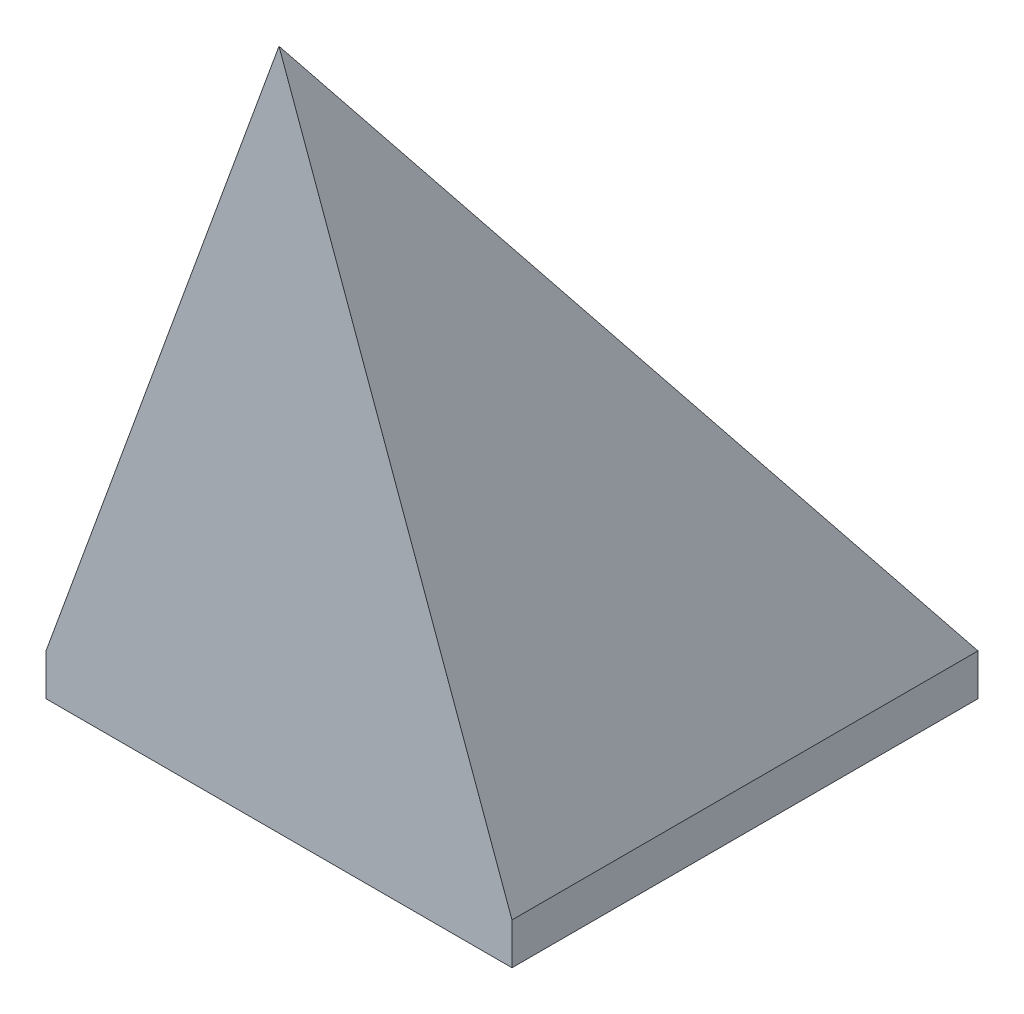
ISO-10303-21;
HEADER;
FILE_DESCRIPTION(('STEP AP214'),'2;1');
FILE_NAME('part.step','',(''),(''),'','','');
FILE_SCHEMA(('AUTOMOTIVE_DESIGN { 1 0 10303 214 1 1 1 1 }'));
ENDSEC;
DATA;
#1=APPLICATION_CONTEXT('core data for automotive mechanical design processes');
#2=APPLICATION_PROTOCOL_DEFINITION('international standard','automotive_design',2000,#1);
#3=PRODUCT_CONTEXT('',#1,'mechanical');
#4=PRODUCT('Part','Part','',(#3));
#5=PRODUCT_RELATED_PRODUCT_CATEGORY('part','',(#4));
#6=PRODUCT_DEFINITION_FORMATION('','',#4);
#7=PRODUCT_DEFINITION_CONTEXT('part definition',#1,'design');
#8=PRODUCT_DEFINITION('design','',#6,#7);
#9=PRODUCT_DEFINITION_SHAPE('','',#8);
#10=(LENGTH_UNIT() NAMED_UNIT(*) SI_UNIT(.MILLI.,.METRE.));
#11=(NAMED_UNIT(*) PLANE_ANGLE_UNIT() SI_UNIT($,.RADIAN.));
#12=(NAMED_UNIT(*) SI_UNIT($,.STERADIAN.) SOLID_ANGLE_UNIT());
#13=UNCERTAINTY_MEASURE_WITH_UNIT(LENGTH_MEASURE(1.E-05),#10,'distance_accuracy_value','');
#14=(GEOMETRIC_REPRESENTATION_CONTEXT(3) GLOBAL_UNCERTAINTY_ASSIGNED_CONTEXT((#13)) GLOBAL_UNIT_ASSIGNED_CONTEXT((#10,
#11,#12)) REPRESENTATION_CONTEXT('',''));
#15=CARTESIAN_POINT('',(0.,0.,0.));
#16=DIRECTION('',(0.,0.,1.));
#17=DIRECTION('',(1.,0.,0.));
#18=AXIS2_PLACEMENT_3D('',#15,#16,#17);
#19=CARTESIAN_POINT('',(0.,0.,-5.));
#20=DIRECTION('',(0.,0.,-1.));
#21=DIRECTION('',(-1.,0.,0.));
#22=AXIS2_PLACEMENT_3D('',#19,#20,#21);
#23=PLANE('',#22);
#24=DIRECTION('',(0.,1.,0.));
#25=VECTOR('',#24,1.);
#26=CARTESIAN_POINT('',(25.,3.99999999999999,-5.));
#27=LINE('',#26,#25);
#28=CARTESIAN_POINT('',(25.,8.99999999999999,-5.));
#29=VERTEX_POINT('',#28);
#30=CARTESIAN_POINT('',(25.,26.6917459263319,-5.));
#31=VERTEX_POINT('',#30);
#32=EDGE_CURVE('E216',#29,#31,#27,.T.);
#33=ORIENTED_EDGE('',*,*,#32,.T.);
#34=DIRECTION('',(1.,0.,0.));
#35=VECTOR('',#34,1.);
#36=CARTESIAN_POINT('',(-9.2416804367933,26.6917459263319,-5.));
#37=LINE('',#36,#35);
#38=CARTESIAN_POINT('',(29.7408799192839,26.6917459263319,-5.));
#39=VERTEX_POINT('',#38);
#40=EDGE_CURVE('E202',#31,#39,#37,.T.);
#41=ORIENTED_EDGE('',*,*,#40,.T.);
#42=DIRECTION('',(0.342020143325666,-0.939692620785909,0.));
#43=VECTOR('',#42,1.);
#44=CARTESIAN_POINT('',(15.5,65.8182419377296,-5.));
#45=LINE('',#44,#43);
#46=CARTESIAN_POINT('',(36.180148828669,9.,-5.));
#47=VERTEX_POINT('',#46);
#48=EDGE_CURVE('E291',#39,#47,#45,.T.);
#49=ORIENTED_EDGE('',*,*,#48,.T.);
#50=DIRECTION('',(-1.,0.,0.));
#51=VECTOR('',#50,1.);
#52=CARTESIAN_POINT('',(0.,8.99999999999999,-5.));
#53=LINE('',#52,#51);
#54=EDGE_CURVE('E399',#47,#29,#53,.T.);
#55=ORIENTED_EDGE('',*,*,#54,.T.);
#56=EDGE_LOOP('',(#33,#41,#49,#55));
#57=FACE_BOUND('',#56,.T.);
#58=ADVANCED_FACE('F47',(#57),#23,.T.);
#59=CARTESIAN_POINT('',(0.,4.,0.));
#60=DIRECTION('',(0.,-1.,0.));
#61=DIRECTION('',(0.,0.,-1.));
#62=AXIS2_PLACEMENT_3D('',#59,#60,#61);
#63=PLANE('',#62);
#64=CARTESIAN_POINT('',(30.,4.,-30.));
#65=DIRECTION('',(0.,1.,0.));
#66=DIRECTION('',(0.,0.,1.));
#67=AXIS2_PLACEMENT_3D('',#64,#65,#66);
#68=CIRCLE('',#67,1.7);
#69=CARTESIAN_POINT('',(30.,4.,-28.3));
#70=VERTEX_POINT('',#69);
#71=EDGE_CURVE('E323',#70,#70,#68,.T.);
#72=ORIENTED_EDGE('',*,*,#71,.F.);
#73=EDGE_LOOP('',(#72));
#74=FACE_BOUND('',#73,.T.);
#75=CARTESIAN_POINT('',(30.,4.,-15.));
#76=DIRECTION('',(0.,1.,0.));
#77=DIRECTION('',(0.,0.,1.));
#78=AXIS2_PLACEMENT_3D('',#75,#76,#77);
#79=CIRCLE('',#78,1.7);
#80=CARTESIAN_POINT('',(30.,4.,-13.3));
#81=VERTEX_POINT('',#80);
#82=EDGE_CURVE('E307',#81,#81,#79,.T.);
#83=ORIENTED_EDGE('',*,*,#82,.F.);
#84=EDGE_LOOP('',(#83));
#85=FACE_BOUND('',#84,.T.);
#86=DIRECTION('',(1.,0.,0.));
#87=VECTOR('',#86,1.);
#88=CARTESIAN_POINT('',(-1.04926296840795,4.00000000000002,-40.0123714323412));
#89=LINE('',#88,#87);
#90=CARTESIAN_POINT('',(25.,4.00000000000002,-40.0123714323412));
#91=VERTEX_POINT('',#90);
#92=CARTESIAN_POINT('',(40.6259278574256,4.,-40.0123714323412));
#93=VERTEX_POINT('',#92);
#94=EDGE_CURVE('E248',#91,#93,#89,.T.);
#95=ORIENTED_EDGE('',*,*,#94,.F.);
#96=DIRECTION('',(0.,0.,-1.));
#97=VECTOR('',#96,1.);
#98=CARTESIAN_POINT('',(25.,3.99999999999999,15.7251116191808));
#99=LINE('',#98,#97);
#100=CARTESIAN_POINT('',(25.,4.,-10.));
#101=VERTEX_POINT('',#100);
#102=EDGE_CURVE('E213',#101,#91,#99,.T.);
#103=ORIENTED_EDGE('',*,*,#102,.F.);
#104=DIRECTION('',(1.,0.,0.));
#105=VECTOR('',#104,1.);
#106=CARTESIAN_POINT('',(0.,4.,-10.));
#107=LINE('',#106,#105);
#108=CARTESIAN_POINT('',(38.375,4.,-10.));
#109=VERTEX_POINT('',#108);
#110=EDGE_CURVE('E389',#101,#109,#107,.T.);
#111=ORIENTED_EDGE('',*,*,#110,.T.);
#112=DIRECTION('',(-0.0747899482416341,0.,0.997199309888456));
#113=VECTOR('',#112,1.);
#114=CARTESIAN_POINT('',(41.,4.,-45.));
#115=LINE('',#114,#113);
#116=EDGE_CURVE('E287',#93,#109,#115,.T.);
#117=ORIENTED_EDGE('',*,*,#116,.F.);
#118=EDGE_LOOP('',(#95,#103,#111,#117));
#119=FACE_BOUND('',#118,.T.);
#120=ADVANCED_FACE('F447',(#74,#85,#119),#63,.F.);
#121=CARTESIAN_POINT('',(-1.63682684084202,6.29745498866973,-43.3275895391157));
#122=DIRECTION('',(0.,-0.821924771568956,-0.569596058519825));
#123=DIRECTION('',(0.,0.569596058519825,-0.821924771568956));
#124=AXIS2_PLACEMENT_3D('',#121,#122,#123);
#125=PLANE('',#124);
#126=DIRECTION('',(1.,0.,0.));
#127=VECTOR('',#126,1.);
#128=CARTESIAN_POINT('',(-1.63682684084202,6.29745498866973,-43.3275895391157));
#129=LINE('',#128,#127);
#130=CARTESIAN_POINT('',(25.,6.29745498866973,-43.3275895391157));
#131=VERTEX_POINT('',#130);
#132=CARTESIAN_POINT('',(40.0383639849915,6.29745498866972,-43.3275895391157));
#133=VERTEX_POINT('',#132);
#134=EDGE_CURVE('E64',#131,#133,#129,.T.);
#135=ORIENTED_EDGE('',*,*,#134,.F.);
#136=DIRECTION('',(0.,-0.569596058519825,0.821924771568956));
#137=VECTOR('',#136,1.);
#138=CARTESIAN_POINT('',(25.,6.29745498866972,-43.3275895391157));
#139=LINE('',#138,#137);
#140=EDGE_CURVE('E207',#131,#91,#139,.T.);
#141=ORIENTED_EDGE('',*,*,#140,.T.);
#142=ORIENTED_EDGE('',*,*,#94,.T.);
#143=DIRECTION('',(-0.144150231282634,0.563647091857813,-0.813340437124205));
#144=VECTOR('',#143,1.);
#145=CARTESIAN_POINT('',(40.0383639849915,6.29745498866972,-43.3275895391157));
#146=LINE('',#145,#144);
#147=EDGE_CURVE('E262',#93,#133,#146,.T.);
#148=ORIENTED_EDGE('',*,*,#147,.T.);
#149=EDGE_LOOP('',(#135,#141,#142,#148));
#150=FACE_BOUND('',#149,.T.);
#151=ADVANCED_FACE('F444',(#150),#125,.F.);
#152=CARTESIAN_POINT('',(0.,4.,-10.));
#153=DIRECTION('',(0.,-0.707106781186551,0.707106781186543));
#154=DIRECTION('',(1.,0.,0.));
#155=AXIS2_PLACEMENT_3D('',#152,#153,#154);
#156=PLANE('',#155);
#157=ORIENTED_EDGE('',*,*,#110,.F.);
#158=DIRECTION('',(0.,0.707106781186544,0.707106781186552));
#159=VECTOR('',#158,1.);
#160=CARTESIAN_POINT('',(25.,4.,-10.0000000000001));
#161=LINE('',#160,#159);
#162=EDGE_CURVE('E230',#101,#29,#161,.T.);
#163=ORIENTED_EDGE('',*,*,#162,.T.);
#164=ORIENTED_EDGE('',*,*,#54,.F.);
#165=DIRECTION('',(-0.296446257969895,0.675322003245724,0.675322003245732));
#166=VECTOR('',#165,1.);
#167=CARTESIAN_POINT('',(35.0025902692054,11.6825476251984,-2.31745237480159));
#168=LINE('',#167,#166);
#169=EDGE_CURVE('E394',#109,#47,#168,.T.);
#170=ORIENTED_EDGE('',*,*,#169,.F.);
#171=EDGE_LOOP('',(#157,#163,#164,#170));
#172=FACE_BOUND('',#171,.T.);
#173=ADVANCED_FACE('F430',(#172),#156,.F.);
#174=CARTESIAN_POINT('',(-7.71337836358146,27.2480023899483,-28.0768382478187));
#175=DIRECTION('',(0.,0.999709612224043,0.0240975357008303));
#176=DIRECTION('',(0.,-0.0240975357008303,0.999709612224044));
#177=AXIS2_PLACEMENT_3D('',#174,#175,#176);
#178=PLANE('',#177);
#179=ORIENTED_EDGE('',*,*,#40,.F.);
#180=DIRECTION('',(0.,0.0240975357008303,-0.999709612224044));
#181=VECTOR('',#180,1.);
#182=CARTESIAN_POINT('',(25.,27.2480023899483,-28.0768382478187));
#183=LINE('',#182,#181);
#184=CARTESIAN_POINT('',(25.,27.2480023899483,-28.0768382478187));
#185=VERTEX_POINT('',#184);
#186=EDGE_CURVE('E11',#31,#185,#183,.T.);
#187=ORIENTED_EDGE('',*,*,#186,.T.);
#188=DIRECTION('',(1.,0.,0.));
#189=VECTOR('',#188,1.);
#190=CARTESIAN_POINT('',(-7.71337836358146,27.2480023899483,-28.0768382478187));
#191=LINE('',#190,#189);
#192=CARTESIAN_POINT('',(31.2691819924957,27.2480023899483,-28.0768382478187));
#193=VERTEX_POINT('',#192);
#194=EDGE_CURVE('E185',#185,#193,#191,.T.);
#195=ORIENTED_EDGE('',*,*,#194,.T.);
#196=DIRECTION('',(-0.0660628028719148,-0.0240448938375724,0.99752571353176));
#197=VECTOR('',#196,1.);
#198=CARTESIAN_POINT('',(31.2691819924958,27.2480023899483,-28.0768382478187));
#199=LINE('',#198,#197);
#200=EDGE_CURVE('E235',#193,#39,#199,.T.);
#201=ORIENTED_EDGE('',*,*,#200,.T.);
#202=EDGE_LOOP('',(#179,#187,#195,#201));
#203=FACE_BOUND('',#202,.T.);
#204=ADVANCED_FACE('F201',(#203),#178,.F.);
#205=CARTESIAN_POINT('',(26.5,65.8182419377296,-45.));
#206=DIRECTION('',(-0.937367552049994,0.341173887513169,0.0703025664037495));
#207=DIRECTION('',(-0.342020143325666,-0.93969262078591,0.));
#208=AXIS2_PLACEMENT_3D('',#205,#206,#207);
#209=PLANE('',#208);
#210=DIRECTION('',(-0.0660628028719149,0.0240448938375722,-0.99752571353176));
#211=VECTOR('',#210,1.);
#212=CARTESIAN_POINT('',(16.8473653381984,31.4345607902734,-6.83997572836898));
#213=LINE('',#212,#211);
#214=CARTESIAN_POINT('',(16.9692207973444,31.3902090302615,-5.));
#215=VERTEX_POINT('',#214);
#216=CARTESIAN_POINT('',(15.6635213304612,31.8654447711042,-24.7156150774588));
#217=VERTEX_POINT('',#216);
#218=EDGE_CURVE('E244',#215,#217,#213,.T.);
#219=ORIENTED_EDGE('',*,*,#218,.T.);
#220=DIRECTION('',(0.320545338336161,0.765818329556568,0.557470153628106));
#221=VECTOR('',#220,1.);
#222=CARTESIAN_POINT('',(21.486970410173,45.7783098579321,-14.5878775475252));
#223=LINE('',#222,#221);
#224=CARTESIAN_POINT('',(22.5,48.198549791227,-12.8260869565217));
#225=VERTEX_POINT('',#224);
#226=EDGE_CURVE('E279',#217,#225,#223,.T.);
#227=ORIENTED_EDGE('',*,*,#226,.T.);
#228=DIRECTION('',(0.,0.201820591814558,-0.979422507766501));
#229=VECTOR('',#228,1.);
#230=CARTESIAN_POINT('',(22.5,55.2759683295198,-47.1723494016202));
#231=LINE('',#230,#229);
#232=CARTESIAN_POINT('',(22.5,46.5859000015471,-5.));
#233=VERTEX_POINT('',#232);
#234=EDGE_CURVE('E382',#233,#225,#231,.T.);
#235=ORIENTED_EDGE('',*,*,#234,.F.);
#236=DIRECTION('',(0.342020143325666,0.93969262078591,0.));
#237=VECTOR('',#236,1.);
#238=CARTESIAN_POINT('',(4.89558033154337,-1.78184552014083,-5.));
#239=LINE('',#238,#237);
#240=EDGE_CURVE('E377',#215,#233,#239,.T.);
#241=ORIENTED_EDGE('',*,*,#240,.F.);
#242=EDGE_LOOP('',(#219,#227,#235,#241));
#243=FACE_BOUND('',#242,.T.);
#244=ADVANCED_FACE('F503',(#243),#209,.F.);
#245=DIRECTION('',(0.0660628028719149,-0.0240448938375724,0.99752571353176));
#246=VECTOR('',#245,1.);
#247=CARTESIAN_POINT('',(13.637229231592,27.2820659186418,-29.4899967335618));
#248=LINE('',#247,#246);
#249=CARTESIAN_POINT('',(13.7308180075042,27.2480023899483,-28.0768382478187));
#250=VERTEX_POINT('',#249);
#251=CARTESIAN_POINT('',(15.2591200807161,26.6917459263319,-5.));
#252=VERTEX_POINT('',#251);
#253=EDGE_CURVE('E238',#250,#252,#248,.T.);
#254=ORIENTED_EDGE('',*,*,#253,.T.);
#255=CARTESIAN_POINT('',(8.81985117133099,8.99999999999999,-5.));
#256=VERTEX_POINT('',#255);
#257=EDGE_CURVE('E378',#256,#252,#239,.T.);
#258=ORIENTED_EDGE('',*,*,#257,.F.);
#259=DIRECTION('',(-0.296446257969895,-0.675322003245724,-0.675322003245732));
#260=VECTOR('',#259,1.);
#261=CARTESIAN_POINT('',(6.04279245689865,2.6736969897866,-11.3263030102135));
#262=LINE('',#261,#260);
#263=CARTESIAN_POINT('',(6.625,4.,-10.));
#264=VERTEX_POINT('',#263);
#265=EDGE_CURVE('E403',#256,#264,#262,.T.);
#266=ORIENTED_EDGE('',*,*,#265,.T.);
#267=DIRECTION('',(-0.0747899482416342,0.,-0.997199309888456));
#268=VECTOR('',#267,1.);
#269=CARTESIAN_POINT('',(4.,4.,-45.));
#270=LINE('',#269,#268);
#271=CARTESIAN_POINT('',(4.37407214257441,4.,-40.0123714323412));
#272=VERTEX_POINT('',#271);
#273=EDGE_CURVE('E296',#264,#272,#270,.T.);
#274=ORIENTED_EDGE('',*,*,#273,.T.);
#275=DIRECTION('',(0.144150231282634,0.563647091857813,-0.813340437124205));
#276=VECTOR('',#275,1.);
#277=CARTESIAN_POINT('',(4.82452464719096,5.76133081430423,-42.5539645588217));
#278=LINE('',#277,#276);
#279=CARTESIAN_POINT('',(4.96163601500849,6.29745498866973,-43.3275895391157));
#280=VERTEX_POINT('',#279);
#281=EDGE_CURVE('E266',#272,#280,#278,.T.);
#282=ORIENTED_EDGE('',*,*,#281,.T.);
#283=EDGE_CURVE('E280',#280,#250,#223,.T.);
#284=ORIENTED_EDGE('',*,*,#283,.T.);
#285=EDGE_LOOP('',(#254,#258,#266,#274,#282,#284));
#286=FACE_BOUND('',#285,.T.);
#287=ADVANCED_FACE('F488',(#286),#209,.F.);
#288=CARTESIAN_POINT('',(18.5,65.8182419377296,-45.));
#289=DIRECTION('',(0.937367552049994,0.34117388751317,0.0703025664037494));
#290=DIRECTION('',(-0.342020143325666,0.93969262078591,0.));
#291=AXIS2_PLACEMENT_3D('',#288,#289,#290);
#292=PLANE('',#291);
#293=DIRECTION('',(0.0660628028719148,0.0240448938375722,-0.99752571353176));
#294=VECTOR('',#293,1.);
#295=CARTESIAN_POINT('',(28.0307792026556,31.3902090302615,-5.));
#296=LINE('',#295,#294);
#297=CARTESIAN_POINT('',(28.0307792026556,31.3902090302615,-5.));
#298=VERTEX_POINT('',#297);
#299=CARTESIAN_POINT('',(29.3364786695388,31.8654447711042,-24.7156150774588));
#300=VERTEX_POINT('',#299);
#301=EDGE_CURVE('E239',#298,#300,#296,.T.);
#302=ORIENTED_EDGE('',*,*,#301,.F.);
#303=EDGE_CURVE('E292',#233,#298,#45,.T.);
#304=ORIENTED_EDGE('',*,*,#303,.F.);
#305=ORIENTED_EDGE('',*,*,#234,.T.);
#306=DIRECTION('',(0.320545338336161,-0.765818329556568,-0.557470153628106));
#307=VECTOR('',#306,1.);
#308=CARTESIAN_POINT('',(23.513029589827,45.7783098579321,-14.5878775475252));
#309=LINE('',#308,#307);
#310=EDGE_CURVE('E386',#225,#300,#309,.T.);
#311=ORIENTED_EDGE('',*,*,#310,.T.);
#312=EDGE_LOOP('',(#302,#304,#305,#311));
#313=FACE_BOUND('',#312,.T.);
#314=ADVANCED_FACE('F586',(#313),#292,.F.);
#315=ORIENTED_EDGE('',*,*,#200,.F.);
#316=EDGE_CURVE('E191',#193,#133,#309,.T.);
#317=ORIENTED_EDGE('',*,*,#316,.T.);
#318=ORIENTED_EDGE('',*,*,#147,.F.);
#319=ORIENTED_EDGE('',*,*,#116,.T.);
#320=ORIENTED_EDGE('',*,*,#169,.T.);
#321=ORIENTED_EDGE('',*,*,#48,.F.);
#322=EDGE_LOOP('',(#315,#317,#318,#319,#320,#321));
#323=FACE_BOUND('',#322,.T.);
#324=ADVANCED_FACE('F446',(#323),#292,.F.);
#325=ORIENTED_EDGE('',*,*,#303,.T.);
#326=DIRECTION('',(1.,0.,0.));
#327=VECTOR('',#326,1.);
#328=CARTESIAN_POINT('',(-10.9517811534216,31.3902090302615,-5.));
#329=LINE('',#328,#327);
#330=EDGE_CURVE('E243',#215,#298,#329,.T.);
#331=ORIENTED_EDGE('',*,*,#330,.F.);
#332=ORIENTED_EDGE('',*,*,#240,.T.);
#333=EDGE_LOOP('',(#325,#331,#332));
#334=FACE_BOUND('',#333,.T.);
#335=ADVANCED_FACE('F459',(#334),#23,.T.);
#336=DIRECTION('',(0.,-1.,0.));
#337=VECTOR('',#336,1.);
#338=CARTESIAN_POINT('',(20.,3.99999999999999,-5.));
#339=LINE('',#338,#337);
#340=CARTESIAN_POINT('',(20.,26.6917459263319,-5.));
#341=VERTEX_POINT('',#340);
#342=CARTESIAN_POINT('',(20.,8.99999999999999,-5.));
#343=VERTEX_POINT('',#342);
#344=EDGE_CURVE('E222',#341,#343,#339,.T.);
#345=ORIENTED_EDGE('',*,*,#344,.T.);
#346=EDGE_CURVE('E398',#343,#256,#53,.T.);
#347=ORIENTED_EDGE('',*,*,#346,.T.);
#348=ORIENTED_EDGE('',*,*,#257,.T.);
#349=EDGE_CURVE('E254',#252,#341,#37,.T.);
#350=ORIENTED_EDGE('',*,*,#349,.T.);
#351=EDGE_LOOP('',(#345,#347,#348,#350));
#352=FACE_BOUND('',#351,.T.);
#353=ADVANCED_FACE('F416',(#352),#23,.T.);
#354=CARTESIAN_POINT('',(15.,4.,-15.));
#355=DIRECTION('',(0.,1.,0.));
#356=DIRECTION('',(0.,0.,1.));
#357=AXIS2_PLACEMENT_3D('',#354,#355,#356);
#358=CIRCLE('',#357,1.7);
#359=CARTESIAN_POINT('',(15.,4.,-13.3));
#360=VERTEX_POINT('',#359);
#361=EDGE_CURVE('E315',#360,#360,#358,.T.);
#362=ORIENTED_EDGE('',*,*,#361,.F.);
#363=EDGE_LOOP('',(#362));
#364=FACE_BOUND('',#363,.T.);
#365=CARTESIAN_POINT('',(15.,4.,-30.));
#366=DIRECTION('',(0.,1.,0.));
#367=DIRECTION('',(0.,0.,1.));
#368=AXIS2_PLACEMENT_3D('',#365,#366,#367);
#369=CIRCLE('',#368,1.7);
#370=CARTESIAN_POINT('',(15.,4.,-28.3));
#371=VERTEX_POINT('',#370);
#372=EDGE_CURVE('E331',#371,#371,#369,.T.);
#373=ORIENTED_EDGE('',*,*,#372,.F.);
#374=EDGE_LOOP('',(#373));
#375=FACE_BOUND('',#374,.T.);
#376=CARTESIAN_POINT('',(20.,4.,-10.));
#377=VERTEX_POINT('',#376);
#378=EDGE_CURVE('E390',#264,#377,#107,.T.);
#379=ORIENTED_EDGE('',*,*,#378,.T.);
#380=DIRECTION('',(0.,0.,-1.));
#381=VECTOR('',#380,1.);
#382=CARTESIAN_POINT('',(20.,3.99999999999999,15.7251116191808));
#383=LINE('',#382,#381);
#384=CARTESIAN_POINT('',(20.,4.00000000000002,-40.0123714323412));
#385=VERTEX_POINT('',#384);
#386=EDGE_CURVE('E219',#377,#385,#383,.T.);
#387=ORIENTED_EDGE('',*,*,#386,.T.);
#388=EDGE_CURVE('E265',#272,#385,#89,.T.);
#389=ORIENTED_EDGE('',*,*,#388,.F.);
#390=ORIENTED_EDGE('',*,*,#273,.F.);
#391=EDGE_LOOP('',(#379,#387,#389,#390));
#392=FACE_BOUND('',#391,.T.);
#393=ADVANCED_FACE('F451',(#364,#375,#392),#63,.F.);
#394=CARTESIAN_POINT('',(0.,4.,-5.));
#395=DIRECTION('',(0.93969262078591,-0.342020143325666,0.));
#396=DIRECTION('',(0.342020143325666,0.93969262078591,0.));
#397=AXIS2_PLACEMENT_3D('',#394,#395,#396);
#398=PLANE('',#397);
#399=DIRECTION('',(0.342020143325666,0.939692620785909,0.));
#400=VECTOR('',#399,1.);
#401=CARTESIAN_POINT('',(0.,4.,0.));
#402=LINE('',#401,#400);
#403=CARTESIAN_POINT('',(0.,4.,0.));
#404=VERTEX_POINT('',#403);
#405=CARTESIAN_POINT('',(22.5,65.8182419377296,0.));
#406=VERTEX_POINT('',#405);
#407=EDGE_CURVE('E302',#404,#406,#402,.T.);
#408=ORIENTED_EDGE('',*,*,#407,.T.);
#409=DIRECTION('',(-0.282294102562339,-0.775596672435241,-0.564588205124678));
#410=VECTOR('',#409,1.);
#411=CARTESIAN_POINT('',(6.3751968273181,21.5157093276354,-32.2496063453638));
#412=LINE('',#411,#410);
#413=CARTESIAN_POINT('',(0.,4.00000000000001,-45.));
#414=VERTEX_POINT('',#413);
#415=EDGE_CURVE('E283',#406,#414,#412,.T.);
#416=ORIENTED_EDGE('',*,*,#415,.T.);
#417=DIRECTION('',(0.,0.,1.));
#418=VECTOR('',#417,1.);
#419=CARTESIAN_POINT('',(0.,4.,0.));
#420=LINE('',#419,#418);
#421=EDGE_CURVE('E339',#414,#404,#420,.T.);
#422=ORIENTED_EDGE('',*,*,#421,.T.);
#423=EDGE_LOOP('',(#408,#416,#422));
#424=FACE_BOUND('',#423,.T.);
#425=ADVANCED_FACE('F465',(#424),#398,.F.);
#426=CARTESIAN_POINT('',(0.,0.,0.));
#427=DIRECTION('',(0.,-1.,0.));
#428=DIRECTION('',(0.,0.,-1.));
#429=AXIS2_PLACEMENT_3D('',#426,#427,#428);
#430=PLANE('',#429);
#431=CARTESIAN_POINT('',(15.,0.,-15.));
#432=DIRECTION('',(0.,1.,0.));
#433=DIRECTION('',(0.,0.,1.));
#434=AXIS2_PLACEMENT_3D('',#431,#432,#433);
#435=CIRCLE('',#434,1.7);
#436=CARTESIAN_POINT('',(15.,0.,-13.3));
#437=VERTEX_POINT('',#436);
#438=EDGE_CURVE('E311',#437,#437,#435,.T.);
#439=ORIENTED_EDGE('',*,*,#438,.T.);
#440=EDGE_LOOP('',(#439));
#441=FACE_BOUND('',#440,.T.);
#442=CARTESIAN_POINT('',(15.,0.,-30.));
#443=DIRECTION('',(0.,1.,0.));
#444=DIRECTION('',(0.,0.,1.));
#445=AXIS2_PLACEMENT_3D('',#442,#443,#444);
#446=CIRCLE('',#445,1.7);
#447=CARTESIAN_POINT('',(15.,0.,-28.3));
#448=VERTEX_POINT('',#447);
#449=EDGE_CURVE('E327',#448,#448,#446,.T.);
#450=ORIENTED_EDGE('',*,*,#449,.T.);
#451=EDGE_LOOP('',(#450));
#452=FACE_BOUND('',#451,.T.);
#453=DIRECTION('',(0.,0.,1.));
#454=VECTOR('',#453,1.);
#455=CARTESIAN_POINT('',(0.,0.,0.));
#456=LINE('',#455,#454);
#457=CARTESIAN_POINT('',(0.,0.,-45.));
#458=VERTEX_POINT('',#457);
#459=CARTESIAN_POINT('',(0.,0.,0.));
#460=VERTEX_POINT('',#459);
#461=EDGE_CURVE('E335',#458,#460,#456,.T.);
#462=ORIENTED_EDGE('',*,*,#461,.F.);
#463=DIRECTION('',(-1.,0.,0.));
#464=VECTOR('',#463,1.);
#465=CARTESIAN_POINT('',(0.,0.,-45.));
#466=LINE('',#465,#464);
#467=CARTESIAN_POINT('',(45.,0.,-45.));
#468=VERTEX_POINT('',#467);
#469=EDGE_CURVE('E343',#468,#458,#466,.T.);
#470=ORIENTED_EDGE('',*,*,#469,.F.);
#471=DIRECTION('',(0.,0.,-1.));
#472=VECTOR('',#471,1.);
#473=CARTESIAN_POINT('',(45.,0.,0.));
#474=LINE('',#473,#472);
#475=CARTESIAN_POINT('',(45.,0.,0.));
#476=VERTEX_POINT('',#475);
#477=EDGE_CURVE('E357',#476,#468,#474,.T.);
#478=ORIENTED_EDGE('',*,*,#477,.F.);
#479=DIRECTION('',(1.,0.,0.));
#480=VECTOR('',#479,1.);
#481=CARTESIAN_POINT('',(0.,0.,0.));
#482=LINE('',#481,#480);
#483=EDGE_CURVE('E354',#460,#476,#482,.T.);
#484=ORIENTED_EDGE('',*,*,#483,.F.);
#485=EDGE_LOOP('',(#462,#470,#478,#484));
#486=FACE_BOUND('',#485,.T.);
#487=CARTESIAN_POINT('',(30.,0.,-30.));
#488=DIRECTION('',(0.,1.,0.));
#489=DIRECTION('',(0.,0.,1.));
#490=AXIS2_PLACEMENT_3D('',#487,#488,#489);
#491=CIRCLE('',#490,1.7);
#492=CARTESIAN_POINT('',(30.,0.,-28.3));
#493=VERTEX_POINT('',#492);
#494=EDGE_CURVE('E319',#493,#493,#491,.T.);
#495=ORIENTED_EDGE('',*,*,#494,.T.);
#496=EDGE_LOOP('',(#495));
#497=FACE_BOUND('',#496,.T.);
#498=CARTESIAN_POINT('',(30.,0.,-15.));
#499=DIRECTION('',(0.,1.,0.));
#500=DIRECTION('',(0.,0.,1.));
#501=AXIS2_PLACEMENT_3D('',#498,#499,#500);
#502=CIRCLE('',#501,1.7);
#503=CARTESIAN_POINT('',(30.,0.,-13.3));
#504=VERTEX_POINT('',#503);
#505=EDGE_CURVE('E306',#504,#504,#502,.T.);
#506=ORIENTED_EDGE('',*,*,#505,.T.);
#507=EDGE_LOOP('',(#506));
#508=FACE_BOUND('',#507,.T.);
#509=ADVANCED_FACE('F472',(#441,#452,#486,#497,#508),#430,.T.);
#510=CARTESIAN_POINT('',(0.,4.,0.));
#511=DIRECTION('',(1.,0.,0.));
#512=DIRECTION('',(0.,0.,-1.));
#513=AXIS2_PLACEMENT_3D('',#510,#511,#512);
#514=PLANE('',#513);
#515=ORIENTED_EDGE('',*,*,#461,.T.);
#516=DIRECTION('',(0.,-1.,0.));
#517=VECTOR('',#516,1.);
#518=CARTESIAN_POINT('',(0.,4.,0.));
#519=LINE('',#518,#517);
#520=EDGE_CURVE('E373',#404,#460,#519,.T.);
#521=ORIENTED_EDGE('',*,*,#520,.F.);
#522=ORIENTED_EDGE('',*,*,#421,.F.);
#523=DIRECTION('',(0.,-1.,0.));
#524=VECTOR('',#523,1.);
#525=CARTESIAN_POINT('',(0.,4.,-45.));
#526=LINE('',#525,#524);
#527=EDGE_CURVE('E350',#414,#458,#526,.T.);
#528=ORIENTED_EDGE('',*,*,#527,.T.);
#529=EDGE_LOOP('',(#515,#521,#522,#528));
#530=FACE_BOUND('',#529,.T.);
#531=ADVANCED_FACE('F631',(#530),#514,.F.);
#532=CARTESIAN_POINT('',(0.,4.,0.));
#533=DIRECTION('',(0.,0.,-1.));
#534=DIRECTION('',(-1.,0.,0.));
#535=AXIS2_PLACEMENT_3D('',#532,#533,#534);
#536=PLANE('',#535);
#537=ORIENTED_EDGE('',*,*,#483,.T.);
#538=DIRECTION('',(0.,-1.,0.));
#539=VECTOR('',#538,1.);
#540=CARTESIAN_POINT('',(45.,4.,0.));
#541=LINE('',#540,#539);
#542=CARTESIAN_POINT('',(45.,4.,0.));
#543=VERTEX_POINT('',#542);
#544=EDGE_CURVE('E369',#543,#476,#541,.T.);
#545=ORIENTED_EDGE('',*,*,#544,.F.);
#546=DIRECTION('',(0.342020143325666,-0.939692620785909,0.));
#547=VECTOR('',#546,1.);
#548=CARTESIAN_POINT('',(22.5,65.8182419377296,0.));
#549=LINE('',#548,#547);
#550=EDGE_CURVE('E299',#406,#543,#549,.T.);
#551=ORIENTED_EDGE('',*,*,#550,.F.);
#552=ORIENTED_EDGE('',*,*,#407,.F.);
#553=ORIENTED_EDGE('',*,*,#520,.T.);
#554=EDGE_LOOP('',(#537,#545,#551,#552,#553));
#555=FACE_BOUND('',#554,.T.);
#556=ADVANCED_FACE('F620',(#555),#536,.F.);
#557=CARTESIAN_POINT('',(45.,4.,0.));
#558=DIRECTION('',(-1.,0.,0.));
#559=DIRECTION('',(0.,0.,1.));
#560=AXIS2_PLACEMENT_3D('',#557,#558,#559);
#561=PLANE('',#560);
#562=ORIENTED_EDGE('',*,*,#477,.T.);
#563=DIRECTION('',(0.,-1.,0.));
#564=VECTOR('',#563,1.);
#565=CARTESIAN_POINT('',(45.,4.,-45.));
#566=LINE('',#565,#564);
#567=CARTESIAN_POINT('',(45.,4.00000000000001,-45.));
#568=VERTEX_POINT('',#567);
#569=EDGE_CURVE('E365',#568,#468,#566,.T.);
#570=ORIENTED_EDGE('',*,*,#569,.F.);
#571=DIRECTION('',(0.,0.,-1.));
#572=VECTOR('',#571,1.);
#573=CARTESIAN_POINT('',(45.,4.,0.));
#574=LINE('',#573,#572);
#575=EDGE_CURVE('E342',#543,#568,#574,.T.);
#576=ORIENTED_EDGE('',*,*,#575,.F.);
#577=ORIENTED_EDGE('',*,*,#544,.T.);
#578=EDGE_LOOP('',(#562,#570,#576,#577));
#579=FACE_BOUND('',#578,.T.);
#580=ADVANCED_FACE('F615',(#579),#561,.F.);
#581=CARTESIAN_POINT('',(0.,4.,-45.));
#582=DIRECTION('',(0.,0.,1.));
#583=DIRECTION('',(1.,0.,0.));
#584=AXIS2_PLACEMENT_3D('',#581,#582,#583);
#585=PLANE('',#584);
#586=ORIENTED_EDGE('',*,*,#527,.F.);
#587=DIRECTION('',(-1.,0.,0.));
#588=VECTOR('',#587,1.);
#589=CARTESIAN_POINT('',(0.,4.,-45.));
#590=LINE('',#589,#588);
#591=EDGE_CURVE('E347',#568,#414,#590,.T.);
#592=ORIENTED_EDGE('',*,*,#591,.F.);
#593=ORIENTED_EDGE('',*,*,#569,.T.);
#594=ORIENTED_EDGE('',*,*,#469,.T.);
#595=EDGE_LOOP('',(#586,#592,#593,#594));
#596=FACE_BOUND('',#595,.T.);
#597=ADVANCED_FACE('F619',(#596),#585,.F.);
#598=CARTESIAN_POINT('',(15.,4.,-30.));
#599=DIRECTION('',(0.,-1.,0.));
#600=DIRECTION('',(0.,0.,-1.));
#601=AXIS2_PLACEMENT_3D('',#598,#599,#600);
#602=CYLINDRICAL_SURFACE('',#601,1.7);
#603=ORIENTED_EDGE('',*,*,#372,.T.);
#604=EDGE_LOOP('',(#603));
#605=FACE_BOUND('',#604,.T.);
#606=ORIENTED_EDGE('',*,*,#449,.F.);
#607=EDGE_LOOP('',(#606));
#608=FACE_BOUND('',#607,.T.);
#609=ADVANCED_FACE('F670',(#605,#608),#602,.F.);
#610=CARTESIAN_POINT('',(30.,4.,-30.));
#611=DIRECTION('',(0.,-1.,0.));
#612=DIRECTION('',(0.,0.,-1.));
#613=AXIS2_PLACEMENT_3D('',#610,#611,#612);
#614=CYLINDRICAL_SURFACE('',#613,1.7);
#615=ORIENTED_EDGE('',*,*,#71,.T.);
#616=EDGE_LOOP('',(#615));
#617=FACE_BOUND('',#616,.T.);
#618=ORIENTED_EDGE('',*,*,#494,.F.);
#619=EDGE_LOOP('',(#618));
#620=FACE_BOUND('',#619,.T.);
#621=ADVANCED_FACE('F661',(#617,#620),#614,.F.);
#622=CARTESIAN_POINT('',(15.,4.,-15.));
#623=DIRECTION('',(0.,-1.,0.));
#624=DIRECTION('',(0.,0.,-1.));
#625=AXIS2_PLACEMENT_3D('',#622,#623,#624);
#626=CYLINDRICAL_SURFACE('',#625,1.7);
#627=ORIENTED_EDGE('',*,*,#361,.T.);
#628=EDGE_LOOP('',(#627));
#629=FACE_BOUND('',#628,.T.);
#630=ORIENTED_EDGE('',*,*,#438,.F.);
#631=EDGE_LOOP('',(#630));
#632=FACE_BOUND('',#631,.T.);
#633=ADVANCED_FACE('F652',(#629,#632),#626,.F.);
#634=CARTESIAN_POINT('',(30.,4.,-15.));
#635=DIRECTION('',(0.,-1.,0.));
#636=DIRECTION('',(0.,0.,-1.));
#637=AXIS2_PLACEMENT_3D('',#634,#635,#636);
#638=CYLINDRICAL_SURFACE('',#637,1.7);
#639=ORIENTED_EDGE('',*,*,#82,.T.);
#640=EDGE_LOOP('',(#639));
#641=FACE_BOUND('',#640,.T.);
#642=ORIENTED_EDGE('',*,*,#505,.F.);
#643=EDGE_LOOP('',(#642));
#644=FACE_BOUND('',#643,.T.);
#645=ADVANCED_FACE('F607',(#641,#644),#638,.F.);
#646=CARTESIAN_POINT('',(22.5,65.8182419377296,-5.));
#647=DIRECTION('',(-0.939692620785909,-0.342020143325666,0.));
#648=DIRECTION('',(0.342020143325666,-0.939692620785909,0.));
#649=AXIS2_PLACEMENT_3D('',#646,#647,#648);
#650=PLANE('',#649);
#651=ORIENTED_EDGE('',*,*,#575,.T.);
#652=DIRECTION('',(0.282294102562339,-0.775596672435241,-0.564588205124678));
#653=VECTOR('',#652,1.);
#654=CARTESIAN_POINT('',(22.5,65.8182419377296,0.));
#655=LINE('',#654,#653);
#656=EDGE_CURVE('E270',#406,#568,#655,.T.);
#657=ORIENTED_EDGE('',*,*,#656,.F.);
#658=ORIENTED_EDGE('',*,*,#550,.T.);
#659=EDGE_LOOP('',(#651,#657,#658));
#660=FACE_BOUND('',#659,.T.);
#661=ADVANCED_FACE('F535',(#660),#650,.F.);
#662=CARTESIAN_POINT('',(-22.5,65.8182419377296,0.));
#663=DIRECTION('',(0.,-0.588524735920102,0.808479211365496));
#664=DIRECTION('',(0.,-0.808479211365496,-0.588524735920102));
#665=AXIS2_PLACEMENT_3D('',#662,#663,#664);
#666=PLANE('',#665);
#667=DIRECTION('',(0.,-0.808479211365496,-0.588524735920102));
#668=VECTOR('',#667,1.);
#669=CARTESIAN_POINT('',(25.,4.,-45.));
#670=LINE('',#669,#668);
#671=EDGE_CURVE('E189',#185,#131,#670,.T.);
#672=ORIENTED_EDGE('',*,*,#671,.T.);
#673=ORIENTED_EDGE('',*,*,#134,.T.);
#674=ORIENTED_EDGE('',*,*,#316,.F.);
#675=ORIENTED_EDGE('',*,*,#194,.F.);
#676=EDGE_LOOP('',(#672,#673,#674,#675));
#677=FACE_BOUND('',#676,.T.);
#678=ORIENTED_EDGE('',*,*,#591,.T.);
#679=ORIENTED_EDGE('',*,*,#415,.F.);
#680=ORIENTED_EDGE('',*,*,#656,.T.);
#681=EDGE_LOOP('',(#678,#679,#680));
#682=FACE_BOUND('',#681,.T.);
#683=CARTESIAN_POINT('',(20.,6.29745498866973,-43.3275895391157));
#684=VERTEX_POINT('',#683);
#685=EDGE_CURVE('E271',#280,#684,#129,.T.);
#686=ORIENTED_EDGE('',*,*,#685,.T.);
#687=DIRECTION('',(0.,0.808479211365496,0.588524735920102));
#688=VECTOR('',#687,1.);
#689=CARTESIAN_POINT('',(20.,4.,-45.));
#690=LINE('',#689,#688);
#691=CARTESIAN_POINT('',(20.,27.2480023899483,-28.0768382478187));
#692=VERTEX_POINT('',#691);
#693=EDGE_CURVE('E209',#684,#692,#690,.T.);
#694=ORIENTED_EDGE('',*,*,#693,.T.);
#695=EDGE_CURVE('E196',#250,#692,#191,.T.);
#696=ORIENTED_EDGE('',*,*,#695,.F.);
#697=ORIENTED_EDGE('',*,*,#283,.F.);
#698=EDGE_LOOP('',(#686,#694,#696,#697));
#699=FACE_BOUND('',#698,.T.);
#700=DIRECTION('',(1.,0.,0.));
#701=VECTOR('',#700,1.);
#702=CARTESIAN_POINT('',(-9.64608168653843,31.8654447711042,-24.7156150774588));
#703=LINE('',#702,#701);
#704=EDGE_CURVE('E197',#217,#300,#703,.T.);
#705=ORIENTED_EDGE('',*,*,#704,.T.);
#706=ORIENTED_EDGE('',*,*,#310,.F.);
#707=ORIENTED_EDGE('',*,*,#226,.F.);
#708=EDGE_LOOP('',(#705,#706,#707));
#709=FACE_BOUND('',#708,.T.);
#710=ADVANCED_FACE('F186',(#677,#682,#699,#709),#666,.F.);
#711=ORIENTED_EDGE('',*,*,#388,.T.);
#712=DIRECTION('',(0.,0.569596058519825,-0.821924771568956));
#713=VECTOR('',#712,1.);
#714=CARTESIAN_POINT('',(20.,6.29745498866972,-43.3275895391157));
#715=LINE('',#714,#713);
#716=EDGE_CURVE('E72',#385,#684,#715,.T.);
#717=ORIENTED_EDGE('',*,*,#716,.T.);
#718=ORIENTED_EDGE('',*,*,#685,.F.);
#719=ORIENTED_EDGE('',*,*,#281,.F.);
#720=EDGE_LOOP('',(#711,#717,#718,#719));
#721=FACE_BOUND('',#720,.T.);
#722=ADVANCED_FACE('F457',(#721),#125,.F.);
#723=ORIENTED_EDGE('',*,*,#346,.F.);
#724=DIRECTION('',(0.,-0.707106781186544,-0.707106781186552));
#725=VECTOR('',#724,1.);
#726=CARTESIAN_POINT('',(20.,4.,-10.));
#727=LINE('',#726,#725);
#728=EDGE_CURVE('E225',#343,#377,#727,.T.);
#729=ORIENTED_EDGE('',*,*,#728,.T.);
#730=ORIENTED_EDGE('',*,*,#378,.F.);
#731=ORIENTED_EDGE('',*,*,#265,.F.);
#732=EDGE_LOOP('',(#723,#729,#730,#731));
#733=FACE_BOUND('',#732,.T.);
#734=ADVANCED_FACE('F50',(#733),#156,.F.);
#735=CARTESIAN_POINT('',(-10.9517811534216,31.3902090302615,-5.));
#736=DIRECTION('',(0.,-0.999709612224043,-0.0240975357008301));
#737=DIRECTION('',(0.,0.0240975357008301,-0.999709612224044));
#738=AXIS2_PLACEMENT_3D('',#735,#736,#737);
#739=PLANE('',#738);
#740=ORIENTED_EDGE('',*,*,#218,.F.);
#741=ORIENTED_EDGE('',*,*,#330,.T.);
#742=ORIENTED_EDGE('',*,*,#301,.T.);
#743=ORIENTED_EDGE('',*,*,#704,.F.);
#744=EDGE_LOOP('',(#740,#741,#742,#743));
#745=FACE_BOUND('',#744,.T.);
#746=ADVANCED_FACE('F491',(#745),#739,.F.);
#747=ORIENTED_EDGE('',*,*,#695,.T.);
#748=DIRECTION('',(0.,-0.0240975357008303,0.999709612224044));
#749=VECTOR('',#748,1.);
#750=CARTESIAN_POINT('',(20.,27.2480023899483,-28.0768382478187));
#751=LINE('',#750,#749);
#752=EDGE_CURVE('E57',#692,#341,#751,.T.);
#753=ORIENTED_EDGE('',*,*,#752,.T.);
#754=ORIENTED_EDGE('',*,*,#349,.F.);
#755=ORIENTED_EDGE('',*,*,#253,.F.);
#756=EDGE_LOOP('',(#747,#753,#754,#755));
#757=FACE_BOUND('',#756,.T.);
#758=ADVANCED_FACE('F409',(#757),#178,.F.);
#759=CARTESIAN_POINT('',(25.,3.99999999999999,15.7251116191808));
#760=DIRECTION('',(1.,0.,0.));
#761=DIRECTION('',(0.,1.,0.));
#762=AXIS2_PLACEMENT_3D('',#759,#760,#761);
#763=PLANE('',#762);
#764=ORIENTED_EDGE('',*,*,#140,.F.);
#765=ORIENTED_EDGE('',*,*,#671,.F.);
#766=ORIENTED_EDGE('',*,*,#186,.F.);
#767=ORIENTED_EDGE('',*,*,#32,.F.);
#768=ORIENTED_EDGE('',*,*,#162,.F.);
#769=ORIENTED_EDGE('',*,*,#102,.T.);
#770=EDGE_LOOP('',(#764,#765,#766,#767,#768,#769));
#771=FACE_BOUND('',#770,.T.);
#772=ADVANCED_FACE('F205',(#771),#763,.T.);
#773=CARTESIAN_POINT('',(20.,3.99999999999999,15.7251116191808));
#774=DIRECTION('',(-1.,0.,0.));
#775=DIRECTION('',(0.,0.,1.));
#776=AXIS2_PLACEMENT_3D('',#773,#774,#775);
#777=PLANE('',#776);
#778=ORIENTED_EDGE('',*,*,#716,.F.);
#779=ORIENTED_EDGE('',*,*,#386,.F.);
#780=ORIENTED_EDGE('',*,*,#728,.F.);
#781=ORIENTED_EDGE('',*,*,#344,.F.);
#782=ORIENTED_EDGE('',*,*,#752,.F.);
#783=ORIENTED_EDGE('',*,*,#693,.F.);
#784=EDGE_LOOP('',(#778,#779,#780,#781,#782,#783));
#785=FACE_BOUND('',#784,.T.);
#786=ADVANCED_FACE('F420',(#785),#777,.T.);
#787=CLOSED_SHELL('',(#58,#120,#151,#173,#204,#244,#287,#314,#324,#335,#353,#393,#425,#509,#531,
#556,#580,#597,#609,#621,#633,#645,#661,#710,#722,#734,#746,#758,#772,#786));
#788=MANIFOLD_SOLID_BREP('B2',#787);
#789=ADVANCED_BREP_SHAPE_REPRESENTATION('',(#18,#788),#14);
#790=SHAPE_DEFINITION_REPRESENTATION(#9,#789);
ENDSEC;
END-ISO-10303-21;
